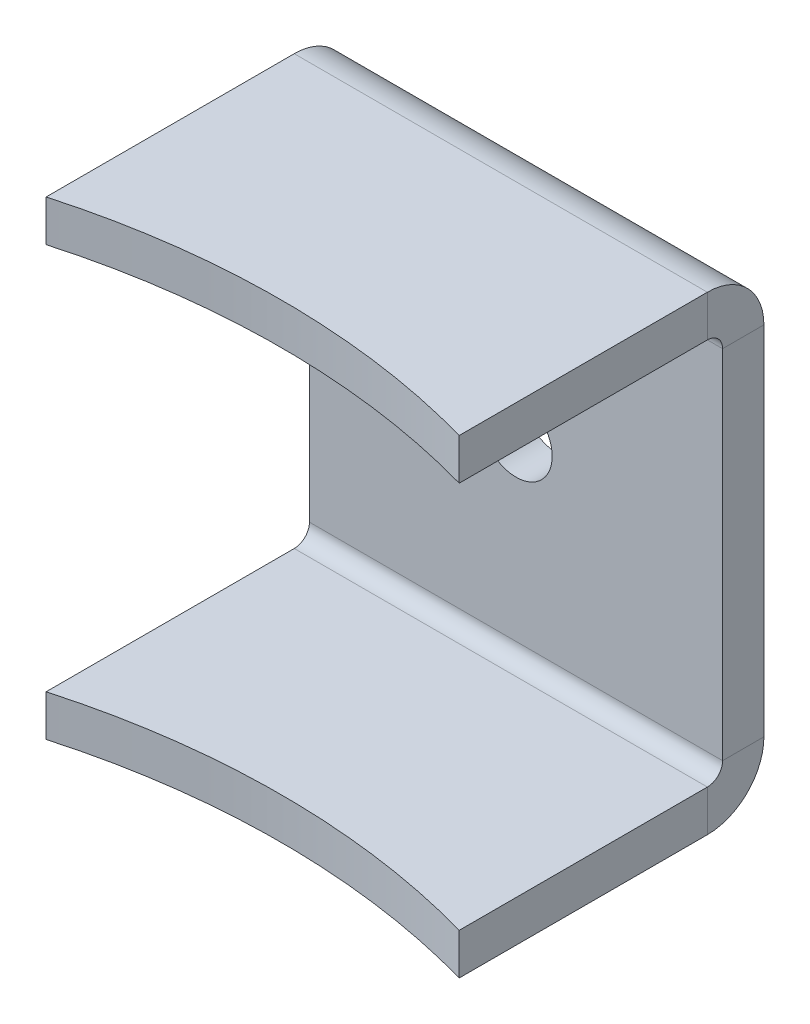
ISO-10303-21;
HEADER;
FILE_DESCRIPTION(('STEP AP214'),'2;1');
FILE_NAME('part.step','',(''),(''),'','','');
FILE_SCHEMA(('AUTOMOTIVE_DESIGN { 1 0 10303 214 1 1 1 1 }'));
ENDSEC;
DATA;
#1=APPLICATION_CONTEXT('core data for automotive mechanical design processes');
#2=APPLICATION_PROTOCOL_DEFINITION('international standard','automotive_design',2000,#1);
#3=PRODUCT_CONTEXT('',#1,'mechanical');
#4=PRODUCT('Part','Part','',(#3));
#5=PRODUCT_RELATED_PRODUCT_CATEGORY('part','',(#4));
#6=PRODUCT_DEFINITION_FORMATION('','',#4);
#7=PRODUCT_DEFINITION_CONTEXT('part definition',#1,'design');
#8=PRODUCT_DEFINITION('design','',#6,#7);
#9=PRODUCT_DEFINITION_SHAPE('','',#8);
#10=(LENGTH_UNIT() NAMED_UNIT(*) SI_UNIT(.MILLI.,.METRE.));
#11=(NAMED_UNIT(*) PLANE_ANGLE_UNIT() SI_UNIT($,.RADIAN.));
#12=(NAMED_UNIT(*) SI_UNIT($,.STERADIAN.) SOLID_ANGLE_UNIT());
#13=UNCERTAINTY_MEASURE_WITH_UNIT(LENGTH_MEASURE(1.E-05),#10,'distance_accuracy_value','');
#14=(GEOMETRIC_REPRESENTATION_CONTEXT(3) GLOBAL_UNCERTAINTY_ASSIGNED_CONTEXT((#13)) GLOBAL_UNIT_ASSIGNED_CONTEXT((#10,
#11,#12)) REPRESENTATION_CONTEXT('',''));
#15=CARTESIAN_POINT('',(0.,0.,0.));
#16=DIRECTION('',(0.,0.,1.));
#17=DIRECTION('',(1.,0.,0.));
#18=AXIS2_PLACEMENT_3D('',#15,#16,#17);
#19=CARTESIAN_POINT('',(0.,-59.,0.));
#20=DIRECTION('',(0.,0.,-1.));
#21=DIRECTION('',(-1.,0.,0.));
#22=AXIS2_PLACEMENT_3D('',#19,#20,#21);
#23=PLANE('',#22);
#24=CARTESIAN_POINT('',(-2.22044604925031E-13,-8.88178419700125E-13,0.));
#25=DIRECTION('',(0.,0.,1.));
#26=DIRECTION('',(1.,0.,0.));
#27=AXIS2_PLACEMENT_3D('',#24,#25,#26);
#28=CIRCLE('',#27,1.74999999999992);
#29=CARTESIAN_POINT('',(1.7499999999997,-8.88178419700125E-13,0.));
#30=VERTEX_POINT('',#29);
#31=EDGE_CURVE('E224',#30,#30,#28,.T.);
#32=ORIENTED_EDGE('',*,*,#31,.F.);
#33=EDGE_LOOP('',(#32));
#34=FACE_BOUND('',#33,.T.);
#35=DIRECTION('',(0.,1.,0.));
#36=VECTOR('',#35,1.);
#37=CARTESIAN_POINT('',(10.,-23.3769737388862,0.));
#38=LINE('',#37,#36);
#39=CARTESIAN_POINT('',(10.,-8.63607754944397,0.));
#40=VERTEX_POINT('',#39);
#41=CARTESIAN_POINT('',(10.,8.63607754944398,0.));
#42=VERTEX_POINT('',#41);
#43=EDGE_CURVE('E64',#40,#42,#38,.T.);
#44=ORIENTED_EDGE('',*,*,#43,.T.);
#45=DIRECTION('',(-1.,0.,0.));
#46=VECTOR('',#45,1.);
#47=CARTESIAN_POINT('',(0.,8.63607754944398,0.));
#48=LINE('',#47,#46);
#49=CARTESIAN_POINT('',(-10.,8.63607754944398,0.));
#50=VERTEX_POINT('',#49);
#51=EDGE_CURVE('E56',#42,#50,#48,.T.);
#52=ORIENTED_EDGE('',*,*,#51,.T.);
#53=DIRECTION('',(0.,-1.,0.));
#54=VECTOR('',#53,1.);
#55=CARTESIAN_POINT('',(-10.,23.3769737388862,0.));
#56=LINE('',#55,#54);
#57=CARTESIAN_POINT('',(-9.99999999999999,-8.63607754944398,0.));
#58=VERTEX_POINT('',#57);
#59=EDGE_CURVE('E72',#50,#58,#56,.T.);
#60=ORIENTED_EDGE('',*,*,#59,.T.);
#61=DIRECTION('',(-1.,0.,0.));
#62=VECTOR('',#61,1.);
#63=CARTESIAN_POINT('',(0.,-8.63607754944398,0.));
#64=LINE('',#63,#62);
#65=EDGE_CURVE('E239',#40,#58,#64,.T.);
#66=ORIENTED_EDGE('',*,*,#65,.F.);
#67=EDGE_LOOP('',(#44,#52,#60,#66));
#68=FACE_BOUND('',#67,.T.);
#69=ADVANCED_FACE('F47',(#34,#68),#23,.F.);
#70=CARTESIAN_POINT('',(-10.,23.3769737388862,-2.));
#71=DIRECTION('',(-1.,0.,0.));
#72=DIRECTION('',(0.,-1.,0.));
#73=AXIS2_PLACEMENT_3D('',#70,#71,#72);
#74=PLANE('',#73);
#75=DIRECTION('',(0.,0.,1.));
#76=VECTOR('',#75,1.);
#77=CARTESIAN_POINT('',(-10.,8.63607754944399,-2.0000000000001));
#78=LINE('',#77,#76);
#79=CARTESIAN_POINT('',(-10.,8.636077549444,-2.));
#80=VERTEX_POINT('',#79);
#81=EDGE_CURVE('E247',#80,#50,#78,.T.);
#82=ORIENTED_EDGE('',*,*,#81,.F.);
#83=DIRECTION('',(0.,-1.,0.));
#84=VECTOR('',#83,1.);
#85=CARTESIAN_POINT('',(-10.,23.3769737388862,-2.));
#86=LINE('',#85,#84);
#87=CARTESIAN_POINT('',(-9.99999999999999,-8.63607754944397,-2.));
#88=VERTEX_POINT('',#87);
#89=EDGE_CURVE('E51',#80,#88,#86,.T.);
#90=ORIENTED_EDGE('',*,*,#89,.T.);
#91=DIRECTION('',(0.,0.,1.));
#92=VECTOR('',#91,1.);
#93=CARTESIAN_POINT('',(-9.99999999999999,-8.63607754944396,-2.00000000000022));
#94=LINE('',#93,#92);
#95=EDGE_CURVE('E242',#88,#58,#94,.T.);
#96=ORIENTED_EDGE('',*,*,#95,.T.);
#97=ORIENTED_EDGE('',*,*,#59,.F.);
#98=EDGE_LOOP('',(#82,#90,#96,#97));
#99=FACE_BOUND('',#98,.T.);
#100=ADVANCED_FACE('F255',(#99),#74,.T.);
#101=CARTESIAN_POINT('',(10.,-23.3769737388862,-2.));
#102=DIRECTION('',(1.,0.,0.));
#103=DIRECTION('',(0.,0.,-1.));
#104=AXIS2_PLACEMENT_3D('',#101,#102,#103);
#105=PLANE('',#104);
#106=DIRECTION('',(0.,0.,-1.));
#107=VECTOR('',#106,1.);
#108=CARTESIAN_POINT('',(10.,8.636077549444,-1.99999999999978));
#109=LINE('',#108,#107);
#110=CARTESIAN_POINT('',(10.,8.636077549444,-2.));
#111=VERTEX_POINT('',#110);
#112=EDGE_CURVE('E12',#42,#111,#109,.T.);
#113=ORIENTED_EDGE('',*,*,#112,.F.);
#114=ORIENTED_EDGE('',*,*,#43,.F.);
#115=DIRECTION('',(0.,0.,-1.));
#116=VECTOR('',#115,1.);
#117=CARTESIAN_POINT('',(10.,-8.63607754944397,-1.9999999999999));
#118=LINE('',#117,#116);
#119=CARTESIAN_POINT('',(10.,-8.63607754944398,-2.));
#120=VERTEX_POINT('',#119);
#121=EDGE_CURVE('E236',#40,#120,#118,.T.);
#122=ORIENTED_EDGE('',*,*,#121,.T.);
#123=DIRECTION('',(0.,1.,0.));
#124=VECTOR('',#123,1.);
#125=CARTESIAN_POINT('',(10.,-23.3769737388862,-2.));
#126=LINE('',#125,#124);
#127=EDGE_CURVE('E251',#120,#111,#126,.T.);
#128=ORIENTED_EDGE('',*,*,#127,.T.);
#129=EDGE_LOOP('',(#113,#114,#122,#128));
#130=FACE_BOUND('',#129,.T.);
#131=ADVANCED_FACE('F49',(#130),#105,.T.);
#132=CARTESIAN_POINT('',(0.,-59.,-2.));
#133=DIRECTION('',(0.,0.,-1.));
#134=DIRECTION('',(-1.,0.,0.));
#135=AXIS2_PLACEMENT_3D('',#132,#133,#134);
#136=PLANE('',#135);
#137=DIRECTION('',(-1.,0.,0.));
#138=VECTOR('',#137,1.);
#139=CARTESIAN_POINT('',(0.,8.636077549444,-2.));
#140=LINE('',#139,#138);
#141=EDGE_CURVE('E244',#111,#80,#140,.T.);
#142=ORIENTED_EDGE('',*,*,#141,.F.);
#143=ORIENTED_EDGE('',*,*,#127,.F.);
#144=DIRECTION('',(-1.,0.,0.));
#145=VECTOR('',#144,1.);
#146=CARTESIAN_POINT('',(0.,-8.63607754944397,-2.));
#147=LINE('',#146,#145);
#148=EDGE_CURVE('E233',#120,#88,#147,.T.);
#149=ORIENTED_EDGE('',*,*,#148,.T.);
#150=ORIENTED_EDGE('',*,*,#89,.F.);
#151=EDGE_LOOP('',(#142,#143,#149,#150));
#152=FACE_BOUND('',#151,.T.);
#153=CARTESIAN_POINT('',(-2.22044604925031E-13,-8.88178419700125E-13,-2.));
#154=DIRECTION('',(0.,0.,1.));
#155=DIRECTION('',(1.,0.,0.));
#156=AXIS2_PLACEMENT_3D('',#153,#154,#155);
#157=CIRCLE('',#156,1.74999999999992);
#158=CARTESIAN_POINT('',(1.7499999999997,-8.88178419700125E-13,-2.));
#159=VERTEX_POINT('',#158);
#160=EDGE_CURVE('E228',#159,#159,#157,.T.);
#161=ORIENTED_EDGE('',*,*,#160,.T.);
#162=EDGE_LOOP('',(#161));
#163=FACE_BOUND('',#162,.T.);
#164=ADVANCED_FACE('F308',(#152,#163),#136,.T.);
#165=CARTESIAN_POINT('',(-2.22044604925031E-13,-8.88178419700125E-13,-2.));
#166=DIRECTION('',(0.,0.,1.));
#167=DIRECTION('',(1.,0.,0.));
#168=AXIS2_PLACEMENT_3D('',#165,#166,#167);
#169=CYLINDRICAL_SURFACE('',#168,1.74999999999992);
#170=ORIENTED_EDGE('',*,*,#160,.F.);
#171=EDGE_LOOP('',(#170));
#172=FACE_BOUND('',#171,.T.);
#173=ORIENTED_EDGE('',*,*,#31,.T.);
#174=EDGE_LOOP('',(#173));
#175=FACE_BOUND('',#174,.T.);
#176=ADVANCED_FACE('F311',(#172,#175),#169,.F.);
#177=CARTESIAN_POINT('',(10.,-8.63607754944397,0.7366));
#178=DIRECTION('',(1.,0.,0.));
#179=DIRECTION('',(0.,0.,-1.));
#180=AXIS2_PLACEMENT_3D('',#177,#178,#179);
#181=PLANE('',#180);
#182=ORIENTED_EDGE('',*,*,#121,.F.);
#183=CARTESIAN_POINT('',(10.,-8.63607754944397,0.7366));
#184=DIRECTION('',(-1.,0.,0.));
#185=DIRECTION('',(0.,-1.,0.));
#186=AXIS2_PLACEMENT_3D('',#183,#184,#185);
#187=CIRCLE('',#186,0.7366);
#188=CARTESIAN_POINT('',(10.,-9.37267754944396,0.736600000000023));
#189=VERTEX_POINT('',#188);
#190=EDGE_CURVE('E188',#40,#189,#187,.T.);
#191=ORIENTED_EDGE('',*,*,#190,.T.);
#192=DIRECTION('',(0.,-1.,0.));
#193=VECTOR('',#192,1.);
#194=CARTESIAN_POINT('',(10.,-11.3726775494439,0.736600000000013));
#195=LINE('',#194,#193);
#196=CARTESIAN_POINT('',(10.,-11.372677549444,0.736600000000016));
#197=VERTEX_POINT('',#196);
#198=EDGE_CURVE('E209',#189,#197,#195,.T.);
#199=ORIENTED_EDGE('',*,*,#198,.T.);
#200=CARTESIAN_POINT('',(10.,-8.63607754944397,0.7366));
#201=DIRECTION('',(-1.,0.,0.));
#202=DIRECTION('',(0.,0.,-1.));
#203=AXIS2_PLACEMENT_3D('',#200,#201,#202);
#204=CIRCLE('',#203,2.7366);
#205=EDGE_CURVE('E217',#120,#197,#204,.T.);
#206=ORIENTED_EDGE('',*,*,#205,.F.);
#207=EDGE_LOOP('',(#182,#191,#199,#206));
#208=FACE_BOUND('',#207,.T.);
#209=ADVANCED_FACE('F274',(#208),#181,.T.);
#210=CARTESIAN_POINT('',(-9.99999999999999,-8.63607754944397,0.7366));
#211=DIRECTION('',(-1.,0.,0.));
#212=DIRECTION('',(0.,0.,1.));
#213=AXIS2_PLACEMENT_3D('',#210,#211,#212);
#214=PLANE('',#213);
#215=CARTESIAN_POINT('',(-9.99999999999999,-8.63607754944397,0.7366));
#216=DIRECTION('',(-1.,0.,0.));
#217=DIRECTION('',(0.,-1.,0.));
#218=AXIS2_PLACEMENT_3D('',#215,#216,#217);
#219=CIRCLE('',#218,0.7366);
#220=CARTESIAN_POINT('',(-9.99999999999999,-9.37267754944397,0.736600000000016));
#221=VERTEX_POINT('',#220);
#222=EDGE_CURVE('E221',#221,#58,#219,.F.);
#223=ORIENTED_EDGE('',*,*,#222,.T.);
#224=ORIENTED_EDGE('',*,*,#95,.F.);
#225=CARTESIAN_POINT('',(-9.99999999999999,-8.63607754944397,0.7366));
#226=DIRECTION('',(1.,0.,0.));
#227=DIRECTION('',(0.,0.,1.));
#228=AXIS2_PLACEMENT_3D('',#225,#226,#227);
#229=CIRCLE('',#228,2.7366);
#230=CARTESIAN_POINT('',(-9.99999999999999,-11.372677549444,0.736600000000001));
#231=VERTEX_POINT('',#230);
#232=EDGE_CURVE('E220',#231,#88,#229,.T.);
#233=ORIENTED_EDGE('',*,*,#232,.F.);
#234=DIRECTION('',(0.,1.,0.));
#235=VECTOR('',#234,1.);
#236=CARTESIAN_POINT('',(-9.99999999999999,-11.3726775494442,0.736600000000016));
#237=LINE('',#236,#235);
#238=EDGE_CURVE('E212',#231,#221,#237,.T.);
#239=ORIENTED_EDGE('',*,*,#238,.T.);
#240=EDGE_LOOP('',(#223,#224,#233,#239));
#241=FACE_BOUND('',#240,.T.);
#242=ADVANCED_FACE('F258',(#241),#214,.T.);
#243=CARTESIAN_POINT('',(20.2840118764638,-8.63607754944396,0.7366));
#244=DIRECTION('',(-1.,0.,0.));
#245=DIRECTION('',(0.,-1.,0.));
#246=AXIS2_PLACEMENT_3D('',#243,#244,#245);
#247=CYLINDRICAL_SURFACE('',#246,2.7366);
#248=DIRECTION('',(-1.,0.,0.));
#249=VECTOR('',#248,1.);
#250=CARTESIAN_POINT('',(0.,-11.372677549444,0.736600000000014));
#251=LINE('',#250,#249);
#252=EDGE_CURVE('E180',#197,#231,#251,.T.);
#253=ORIENTED_EDGE('',*,*,#252,.T.);
#254=ORIENTED_EDGE('',*,*,#232,.T.);
#255=ORIENTED_EDGE('',*,*,#148,.F.);
#256=ORIENTED_EDGE('',*,*,#205,.T.);
#257=EDGE_LOOP('',(#253,#254,#255,#256));
#258=FACE_BOUND('',#257,.T.);
#259=ADVANCED_FACE('F261',(#258),#247,.T.);
#260=CARTESIAN_POINT('',(20.2840118764638,-8.63607754944396,0.7366));
#261=DIRECTION('',(-1.,0.,0.));
#262=DIRECTION('',(0.,-1.,0.));
#263=AXIS2_PLACEMENT_3D('',#260,#261,#262);
#264=CYLINDRICAL_SURFACE('',#263,0.7366);
#265=DIRECTION('',(-1.,0.,0.));
#266=VECTOR('',#265,1.);
#267=CARTESIAN_POINT('',(0.,-9.37267754944397,0.736600000000021));
#268=LINE('',#267,#266);
#269=EDGE_CURVE('E196',#189,#221,#268,.T.);
#270=ORIENTED_EDGE('',*,*,#269,.F.);
#271=ORIENTED_EDGE('',*,*,#190,.F.);
#272=ORIENTED_EDGE('',*,*,#65,.T.);
#273=ORIENTED_EDGE('',*,*,#222,.F.);
#274=EDGE_LOOP('',(#270,#271,#272,#273));
#275=FACE_BOUND('',#274,.T.);
#276=ADVANCED_FACE('F278',(#275),#264,.F.);
#277=CARTESIAN_POINT('',(0.,-11.3726775494438,48.372677549444));
#278=DIRECTION('',(0.,1.,0.));
#279=DIRECTION('',(1.,0.,0.));
#280=AXIS2_PLACEMENT_3D('',#277,#278,#279);
#281=CYLINDRICAL_SURFACE('',#280,37.);
#282=CARTESIAN_POINT('',(0.,-9.3726775494438,48.372677549444));
#283=DIRECTION('',(0.,-1.,0.));
#284=DIRECTION('',(-1.,0.,0.));
#285=AXIS2_PLACEMENT_3D('',#282,#283,#284);
#286=CIRCLE('',#285,37.);
#287=CARTESIAN_POINT('',(-9.99999999999999,-9.37267754944393,12.7496512883303));
#288=VERTEX_POINT('',#287);
#289=CARTESIAN_POINT('',(9.99999999999999,-9.37267754944392,12.7496512883303));
#290=VERTEX_POINT('',#289);
#291=EDGE_CURVE('E191',#288,#290,#286,.T.);
#292=ORIENTED_EDGE('',*,*,#291,.F.);
#293=DIRECTION('',(0.,1.,0.));
#294=VECTOR('',#293,1.);
#295=CARTESIAN_POINT('',(-9.99999999999999,-11.3726775494439,12.7496512883303));
#296=LINE('',#295,#294);
#297=CARTESIAN_POINT('',(-9.99999999999999,-11.3726775494439,12.7496512883303));
#298=VERTEX_POINT('',#297);
#299=EDGE_CURVE('E185',#298,#288,#296,.T.);
#300=ORIENTED_EDGE('',*,*,#299,.F.);
#301=CARTESIAN_POINT('',(0.,-11.3726775494438,48.372677549444));
#302=DIRECTION('',(0.,-1.,0.));
#303=DIRECTION('',(-1.,0.,0.));
#304=AXIS2_PLACEMENT_3D('',#301,#302,#303);
#305=CIRCLE('',#304,37.);
#306=CARTESIAN_POINT('',(9.99999999999999,-11.3726775494439,12.7496512883303));
#307=VERTEX_POINT('',#306);
#308=EDGE_CURVE('E206',#298,#307,#305,.T.);
#309=ORIENTED_EDGE('',*,*,#308,.T.);
#310=DIRECTION('',(0.,1.,0.));
#311=VECTOR('',#310,1.);
#312=CARTESIAN_POINT('',(9.99999999999999,-11.3726775494439,12.7496512883303));
#313=LINE('',#312,#311);
#314=EDGE_CURVE('E204',#307,#290,#313,.T.);
#315=ORIENTED_EDGE('',*,*,#314,.T.);
#316=EDGE_LOOP('',(#292,#300,#309,#315));
#317=FACE_BOUND('',#316,.T.);
#318=ADVANCED_FACE('F332',(#317),#281,.F.);
#319=CARTESIAN_POINT('',(0.,-11.3726775494438,48.372677549444));
#320=DIRECTION('',(0.,-1.,0.));
#321=DIRECTION('',(-1.,0.,0.));
#322=AXIS2_PLACEMENT_3D('',#319,#320,#321);
#323=PLANE('',#322);
#324=ORIENTED_EDGE('',*,*,#252,.F.);
#325=DIRECTION('',(0.,0.,-1.));
#326=VECTOR('',#325,1.);
#327=CARTESIAN_POINT('',(9.99999999999999,-11.3726775494439,12.7496512883303));
#328=LINE('',#327,#326);
#329=EDGE_CURVE('E201',#307,#197,#328,.T.);
#330=ORIENTED_EDGE('',*,*,#329,.F.);
#331=ORIENTED_EDGE('',*,*,#308,.F.);
#332=DIRECTION('',(0.,0.,1.));
#333=VECTOR('',#332,1.);
#334=CARTESIAN_POINT('',(-10.,-11.3726775494441,-34.0042961894422));
#335=LINE('',#334,#333);
#336=EDGE_CURVE('E189',#231,#298,#335,.T.);
#337=ORIENTED_EDGE('',*,*,#336,.F.);
#338=EDGE_LOOP('',(#324,#330,#331,#337));
#339=FACE_BOUND('',#338,.T.);
#340=ADVANCED_FACE('F266',(#339),#323,.T.);
#341=CARTESIAN_POINT('',(9.99999999999999,-11.3726775494439,12.7496512883303));
#342=DIRECTION('',(1.,0.,0.));
#343=DIRECTION('',(0.,-1.,0.));
#344=AXIS2_PLACEMENT_3D('',#341,#342,#343);
#345=PLANE('',#344);
#346=ORIENTED_EDGE('',*,*,#198,.F.);
#347=DIRECTION('',(0.,0.,-1.));
#348=VECTOR('',#347,1.);
#349=CARTESIAN_POINT('',(9.99999999999999,-9.37267754944392,12.7496512883303));
#350=LINE('',#349,#348);
#351=EDGE_CURVE('E199',#290,#189,#350,.T.);
#352=ORIENTED_EDGE('',*,*,#351,.F.);
#353=ORIENTED_EDGE('',*,*,#314,.F.);
#354=ORIENTED_EDGE('',*,*,#329,.T.);
#355=EDGE_LOOP('',(#346,#352,#353,#354));
#356=FACE_BOUND('',#355,.T.);
#357=ADVANCED_FACE('F270',(#356),#345,.T.);
#358=CARTESIAN_POINT('',(0.,-9.3726775494438,48.372677549444));
#359=DIRECTION('',(0.,-1.,0.));
#360=DIRECTION('',(-1.,0.,0.));
#361=AXIS2_PLACEMENT_3D('',#358,#359,#360);
#362=PLANE('',#361);
#363=ORIENTED_EDGE('',*,*,#351,.T.);
#364=ORIENTED_EDGE('',*,*,#269,.T.);
#365=DIRECTION('',(0.,0.,1.));
#366=VECTOR('',#365,1.);
#367=CARTESIAN_POINT('',(-10.,-9.37267754944409,-34.0042961894422));
#368=LINE('',#367,#366);
#369=EDGE_CURVE('E194',#221,#288,#368,.T.);
#370=ORIENTED_EDGE('',*,*,#369,.T.);
#371=ORIENTED_EDGE('',*,*,#291,.T.);
#372=EDGE_LOOP('',(#363,#364,#370,#371));
#373=FACE_BOUND('',#372,.T.);
#374=ADVANCED_FACE('F338',(#373),#362,.F.);
#375=CARTESIAN_POINT('',(-10.,-11.3726775494441,-34.0042961894422));
#376=DIRECTION('',(-1.,0.,0.));
#377=DIRECTION('',(0.,0.,1.));
#378=AXIS2_PLACEMENT_3D('',#375,#376,#377);
#379=PLANE('',#378);
#380=ORIENTED_EDGE('',*,*,#238,.F.);
#381=ORIENTED_EDGE('',*,*,#336,.T.);
#382=ORIENTED_EDGE('',*,*,#299,.T.);
#383=ORIENTED_EDGE('',*,*,#369,.F.);
#384=EDGE_LOOP('',(#380,#381,#382,#383));
#385=FACE_BOUND('',#384,.T.);
#386=ADVANCED_FACE('F335',(#385),#379,.T.);
#387=CARTESIAN_POINT('',(10.,8.636077549444,0.7366));
#388=DIRECTION('',(1.,0.,0.));
#389=DIRECTION('',(0.,0.,-1.));
#390=AXIS2_PLACEMENT_3D('',#387,#388,#389);
#391=PLANE('',#390);
#392=DIRECTION('',(0.,1.,0.));
#393=VECTOR('',#392,1.);
#394=CARTESIAN_POINT('',(10.,11.3726775494437,0.736600000000016));
#395=LINE('',#394,#393);
#396=CARTESIAN_POINT('',(10.,9.37267754944398,0.736600000000002));
#397=VERTEX_POINT('',#396);
#398=CARTESIAN_POINT('',(10.,11.372677549444,0.73659999999999));
#399=VERTEX_POINT('',#398);
#400=EDGE_CURVE('E147',#397,#399,#395,.T.);
#401=ORIENTED_EDGE('',*,*,#400,.F.);
#402=CARTESIAN_POINT('',(10.,8.636077549444,0.7366));
#403=DIRECTION('',(1.,0.,0.));
#404=DIRECTION('',(0.,1.,0.));
#405=AXIS2_PLACEMENT_3D('',#402,#403,#404);
#406=CIRCLE('',#405,0.7366);
#407=EDGE_CURVE('E159',#397,#42,#406,.F.);
#408=ORIENTED_EDGE('',*,*,#407,.T.);
#409=ORIENTED_EDGE('',*,*,#112,.T.);
#410=CARTESIAN_POINT('',(10.,8.636077549444,0.7366));
#411=DIRECTION('',(-1.,0.,0.));
#412=DIRECTION('',(0.,0.,-1.));
#413=AXIS2_PLACEMENT_3D('',#410,#411,#412);
#414=CIRCLE('',#413,2.7366);
#415=EDGE_CURVE('E173',#399,#111,#414,.T.);
#416=ORIENTED_EDGE('',*,*,#415,.F.);
#417=EDGE_LOOP('',(#401,#408,#409,#416));
#418=FACE_BOUND('',#417,.T.);
#419=ADVANCED_FACE('F287',(#418),#391,.T.);
#420=CARTESIAN_POINT('',(-10.,8.63607754944399,0.7366));
#421=DIRECTION('',(-1.,0.,0.));
#422=DIRECTION('',(0.,0.,1.));
#423=AXIS2_PLACEMENT_3D('',#420,#421,#422);
#424=PLANE('',#423);
#425=CARTESIAN_POINT('',(-10.,8.63607754944399,0.7366));
#426=DIRECTION('',(1.,0.,0.));
#427=DIRECTION('',(0.,1.,0.));
#428=AXIS2_PLACEMENT_3D('',#425,#426,#427);
#429=CIRCLE('',#428,0.7366);
#430=CARTESIAN_POINT('',(-10.,9.37267754944398,0.736600000000006));
#431=VERTEX_POINT('',#430);
#432=EDGE_CURVE('E177',#50,#431,#429,.T.);
#433=ORIENTED_EDGE('',*,*,#432,.T.);
#434=DIRECTION('',(0.,-1.,0.));
#435=VECTOR('',#434,1.);
#436=CARTESIAN_POINT('',(-10.,11.3726775494441,0.73660000000002));
#437=LINE('',#436,#435);
#438=CARTESIAN_POINT('',(-10.,11.372677549444,0.736600000000013));
#439=VERTEX_POINT('',#438);
#440=EDGE_CURVE('E295',#439,#431,#437,.T.);
#441=ORIENTED_EDGE('',*,*,#440,.F.);
#442=CARTESIAN_POINT('',(-10.,8.63607754944399,0.7366));
#443=DIRECTION('',(1.,0.,0.));
#444=DIRECTION('',(0.,0.,1.));
#445=AXIS2_PLACEMENT_3D('',#442,#443,#444);
#446=CIRCLE('',#445,2.7366);
#447=EDGE_CURVE('E176',#80,#439,#446,.T.);
#448=ORIENTED_EDGE('',*,*,#447,.F.);
#449=ORIENTED_EDGE('',*,*,#81,.T.);
#450=EDGE_LOOP('',(#433,#441,#448,#449));
#451=FACE_BOUND('',#450,.T.);
#452=ADVANCED_FACE('F305',(#451),#424,.T.);
#453=CARTESIAN_POINT('',(-20.2840118764638,8.63607754944399,0.7366));
#454=DIRECTION('',(1.,0.,0.));
#455=DIRECTION('',(0.,1.,0.));
#456=AXIS2_PLACEMENT_3D('',#453,#454,#455);
#457=CYLINDRICAL_SURFACE('',#456,2.7366);
#458=ORIENTED_EDGE('',*,*,#141,.T.);
#459=ORIENTED_EDGE('',*,*,#447,.T.);
#460=DIRECTION('',(-1.,0.,0.));
#461=VECTOR('',#460,1.);
#462=CARTESIAN_POINT('',(0.,11.372677549444,0.736600000000025));
#463=LINE('',#462,#461);
#464=EDGE_CURVE('E167',#399,#439,#463,.T.);
#465=ORIENTED_EDGE('',*,*,#464,.F.);
#466=ORIENTED_EDGE('',*,*,#415,.T.);
#467=EDGE_LOOP('',(#458,#459,#465,#466));
#468=FACE_BOUND('',#467,.T.);
#469=ADVANCED_FACE('F306',(#468),#457,.T.);
#470=CARTESIAN_POINT('',(-20.2840118764638,8.63607754944399,0.7366));
#471=DIRECTION('',(1.,0.,0.));
#472=DIRECTION('',(0.,1.,0.));
#473=AXIS2_PLACEMENT_3D('',#470,#471,#472);
#474=CYLINDRICAL_SURFACE('',#473,0.7366);
#475=ORIENTED_EDGE('',*,*,#51,.F.);
#476=ORIENTED_EDGE('',*,*,#407,.F.);
#477=DIRECTION('',(-1.,0.,0.));
#478=VECTOR('',#477,1.);
#479=CARTESIAN_POINT('',(0.,9.37267754944398,0.736600000000004));
#480=LINE('',#479,#478);
#481=EDGE_CURVE('E165',#397,#431,#480,.T.);
#482=ORIENTED_EDGE('',*,*,#481,.T.);
#483=ORIENTED_EDGE('',*,*,#432,.F.);
#484=EDGE_LOOP('',(#475,#476,#482,#483));
#485=FACE_BOUND('',#484,.T.);
#486=ADVANCED_FACE('F286',(#485),#474,.F.);
#487=CARTESIAN_POINT('',(0.,11.3726775494438,48.372677549444));
#488=DIRECTION('',(0.,-1.,0.));
#489=DIRECTION('',(1.,0.,0.));
#490=AXIS2_PLACEMENT_3D('',#487,#488,#489);
#491=CYLINDRICAL_SURFACE('',#490,37.);
#492=CARTESIAN_POINT('',(0.,9.37267754944382,48.372677549444));
#493=DIRECTION('',(0.,1.,0.));
#494=DIRECTION('',(1.,0.,0.));
#495=AXIS2_PLACEMENT_3D('',#492,#493,#494);
#496=CIRCLE('',#495,37.);
#497=CARTESIAN_POINT('',(10.,9.37267754944394,12.7496512883302));
#498=VERTEX_POINT('',#497);
#499=CARTESIAN_POINT('',(-10.,9.37267754944394,12.7496512883302));
#500=VERTEX_POINT('',#499);
#501=EDGE_CURVE('E158',#498,#500,#496,.T.);
#502=ORIENTED_EDGE('',*,*,#501,.F.);
#503=DIRECTION('',(0.,-1.,0.));
#504=VECTOR('',#503,1.);
#505=CARTESIAN_POINT('',(10.,11.3726775494439,12.7496512883302));
#506=LINE('',#505,#504);
#507=CARTESIAN_POINT('',(10.,11.3726775494439,12.7496512883302));
#508=VERTEX_POINT('',#507);
#509=EDGE_CURVE('E144',#508,#498,#506,.T.);
#510=ORIENTED_EDGE('',*,*,#509,.F.);
#511=CARTESIAN_POINT('',(0.,11.3726775494438,48.372677549444));
#512=DIRECTION('',(0.,1.,0.));
#513=DIRECTION('',(1.,0.,0.));
#514=AXIS2_PLACEMENT_3D('',#511,#512,#513);
#515=CIRCLE('',#514,37.);
#516=CARTESIAN_POINT('',(-10.,11.3726775494439,12.7496512883303));
#517=VERTEX_POINT('',#516);
#518=EDGE_CURVE('E155',#508,#517,#515,.T.);
#519=ORIENTED_EDGE('',*,*,#518,.T.);
#520=DIRECTION('',(0.,-1.,0.));
#521=VECTOR('',#520,1.);
#522=CARTESIAN_POINT('',(-10.,11.3726775494439,12.7496512883303));
#523=LINE('',#522,#521);
#524=EDGE_CURVE('E164',#517,#500,#523,.T.);
#525=ORIENTED_EDGE('',*,*,#524,.T.);
#526=EDGE_LOOP('',(#502,#510,#519,#525));
#527=FACE_BOUND('',#526,.T.);
#528=ADVANCED_FACE('F154',(#527),#491,.F.);
#529=CARTESIAN_POINT('',(0.,11.3726775494442,-69.627322450556));
#530=DIRECTION('',(0.,1.,0.));
#531=DIRECTION('',(-1.,0.,0.));
#532=AXIS2_PLACEMENT_3D('',#529,#530,#531);
#533=PLANE('',#532);
#534=DIRECTION('',(0.,0.,1.));
#535=VECTOR('',#534,1.);
#536=CARTESIAN_POINT('',(9.99999999999999,11.3726775494441,-34.0042961894422));
#537=LINE('',#536,#535);
#538=EDGE_CURVE('E141',#399,#508,#537,.T.);
#539=ORIENTED_EDGE('',*,*,#538,.F.);
#540=ORIENTED_EDGE('',*,*,#464,.T.);
#541=DIRECTION('',(0.,0.,-1.));
#542=VECTOR('',#541,1.);
#543=CARTESIAN_POINT('',(-10.,11.3726775494439,12.7496512883302));
#544=LINE('',#543,#542);
#545=EDGE_CURVE('E163',#517,#439,#544,.T.);
#546=ORIENTED_EDGE('',*,*,#545,.F.);
#547=ORIENTED_EDGE('',*,*,#518,.F.);
#548=EDGE_LOOP('',(#539,#540,#546,#547));
#549=FACE_BOUND('',#548,.T.);
#550=ADVANCED_FACE('F161',(#549),#533,.T.);
#551=CARTESIAN_POINT('',(-10.,11.3726775494439,12.7496512883302));
#552=DIRECTION('',(-1.,0.,0.));
#553=DIRECTION('',(0.,0.,-1.));
#554=AXIS2_PLACEMENT_3D('',#551,#552,#553);
#555=PLANE('',#554);
#556=ORIENTED_EDGE('',*,*,#545,.T.);
#557=ORIENTED_EDGE('',*,*,#440,.T.);
#558=DIRECTION('',(0.,0.,-1.));
#559=VECTOR('',#558,1.);
#560=CARTESIAN_POINT('',(-10.,9.37267754944394,12.7496512883302));
#561=LINE('',#560,#559);
#562=EDGE_CURVE('E288',#500,#431,#561,.T.);
#563=ORIENTED_EDGE('',*,*,#562,.F.);
#564=ORIENTED_EDGE('',*,*,#524,.F.);
#565=EDGE_LOOP('',(#556,#557,#563,#564));
#566=FACE_BOUND('',#565,.T.);
#567=ADVANCED_FACE('F301',(#566),#555,.T.);
#568=CARTESIAN_POINT('',(0.,9.37267754944423,-69.627322450556));
#569=DIRECTION('',(0.,1.,0.));
#570=DIRECTION('',(-1.,0.,0.));
#571=AXIS2_PLACEMENT_3D('',#568,#569,#570);
#572=PLANE('',#571);
#573=ORIENTED_EDGE('',*,*,#481,.F.);
#574=DIRECTION('',(0.,0.,1.));
#575=VECTOR('',#574,1.);
#576=CARTESIAN_POINT('',(9.99999999999999,9.37267754944411,-34.0042961894423));
#577=LINE('',#576,#575);
#578=EDGE_CURVE('E293',#397,#498,#577,.T.);
#579=ORIENTED_EDGE('',*,*,#578,.T.);
#580=ORIENTED_EDGE('',*,*,#501,.T.);
#581=ORIENTED_EDGE('',*,*,#562,.T.);
#582=EDGE_LOOP('',(#573,#579,#580,#581));
#583=FACE_BOUND('',#582,.T.);
#584=ADVANCED_FACE('F360',(#583),#572,.F.);
#585=CARTESIAN_POINT('',(9.99999999999999,11.3726775494441,-34.0042961894422));
#586=DIRECTION('',(1.,0.,0.));
#587=DIRECTION('',(0.,1.,0.));
#588=AXIS2_PLACEMENT_3D('',#585,#586,#587);
#589=PLANE('',#588);
#590=ORIENTED_EDGE('',*,*,#578,.F.);
#591=ORIENTED_EDGE('',*,*,#400,.T.);
#592=ORIENTED_EDGE('',*,*,#538,.T.);
#593=ORIENTED_EDGE('',*,*,#509,.T.);
#594=EDGE_LOOP('',(#590,#591,#592,#593));
#595=FACE_BOUND('',#594,.T.);
#596=ADVANCED_FACE('F143',(#595),#589,.T.);
#597=CLOSED_SHELL('',(#69,#100,#131,#164,#176,#209,#242,#259,#276,#318,#340,#357,#374,#386,#419,
#452,#469,#486,#528,#550,#567,#584,#596));
#598=MANIFOLD_SOLID_BREP('B2',#597);
#599=ADVANCED_BREP_SHAPE_REPRESENTATION('',(#18,#598),#14);
#600=SHAPE_DEFINITION_REPRESENTATION(#9,#599);
ENDSEC;
END-ISO-10303-21;
